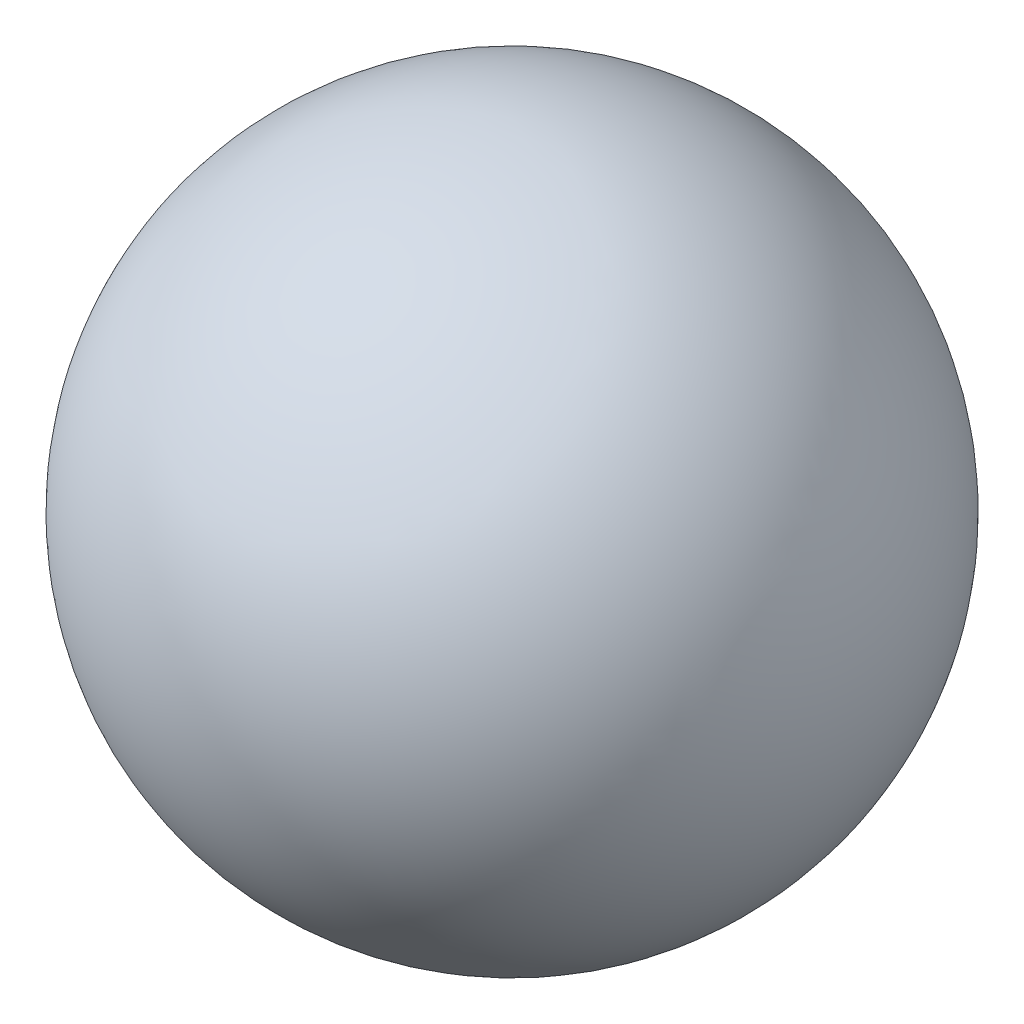
ISO-10303-21;
HEADER;
FILE_DESCRIPTION(('STEP AP214'),'2;1');
FILE_NAME('part.step','',(''),(''),'','','');
FILE_SCHEMA(('AUTOMOTIVE_DESIGN { 1 0 10303 214 1 1 1 1 }'));
ENDSEC;
DATA;
#1=APPLICATION_CONTEXT('core data for automotive mechanical design processes');
#2=APPLICATION_PROTOCOL_DEFINITION('international standard','automotive_design',2000,#1);
#3=PRODUCT_CONTEXT('',#1,'mechanical');
#4=PRODUCT('Part','Part','',(#3));
#5=PRODUCT_RELATED_PRODUCT_CATEGORY('part','',(#4));
#6=PRODUCT_DEFINITION_FORMATION('','',#4);
#7=PRODUCT_DEFINITION_CONTEXT('part definition',#1,'design');
#8=PRODUCT_DEFINITION('design','',#6,#7);
#9=PRODUCT_DEFINITION_SHAPE('','',#8);
#10=(LENGTH_UNIT() NAMED_UNIT(*) SI_UNIT(.MILLI.,.METRE.));
#11=(NAMED_UNIT(*) PLANE_ANGLE_UNIT() SI_UNIT($,.RADIAN.));
#12=(NAMED_UNIT(*) SI_UNIT($,.STERADIAN.) SOLID_ANGLE_UNIT());
#13=UNCERTAINTY_MEASURE_WITH_UNIT(LENGTH_MEASURE(1.E-05),#10,'distance_accuracy_value','');
#14=(GEOMETRIC_REPRESENTATION_CONTEXT(3) GLOBAL_UNCERTAINTY_ASSIGNED_CONTEXT((#13)) GLOBAL_UNIT_ASSIGNED_CONTEXT((#10,
#11,#12)) REPRESENTATION_CONTEXT('',''));
#15=CARTESIAN_POINT('',(0.,0.,0.));
#16=DIRECTION('',(0.,0.,1.));
#17=DIRECTION('',(1.,0.,0.));
#18=AXIS2_PLACEMENT_3D('',#15,#16,#17);
#19=CARTESIAN_POINT('',(0.,0.,0.));
#20=DIRECTION('',(1.,0.,0.));
#21=DIRECTION('',(0.,-1.,0.));
#22=AXIS2_PLACEMENT_3D('',#19,#20,#21);
#23=SPHERICAL_SURFACE('',#22,18.);
#24=CARTESIAN_POINT('',(18.,0.,0.));
#25=VERTEX_POINT('',#24);
#26=VERTEX_LOOP('',#25);
#27=FACE_BOUND('',#26,.T.);
#28=ADVANCED_FACE('F39',(#27),#23,.T.);
#29=CLOSED_SHELL('',(#28));
#30=MANIFOLD_SOLID_BREP('B2',#29);
#31=ADVANCED_BREP_SHAPE_REPRESENTATION('',(#18,#30),#14);
#32=SHAPE_DEFINITION_REPRESENTATION(#9,#31);
ENDSEC;
END-ISO-10303-21;
